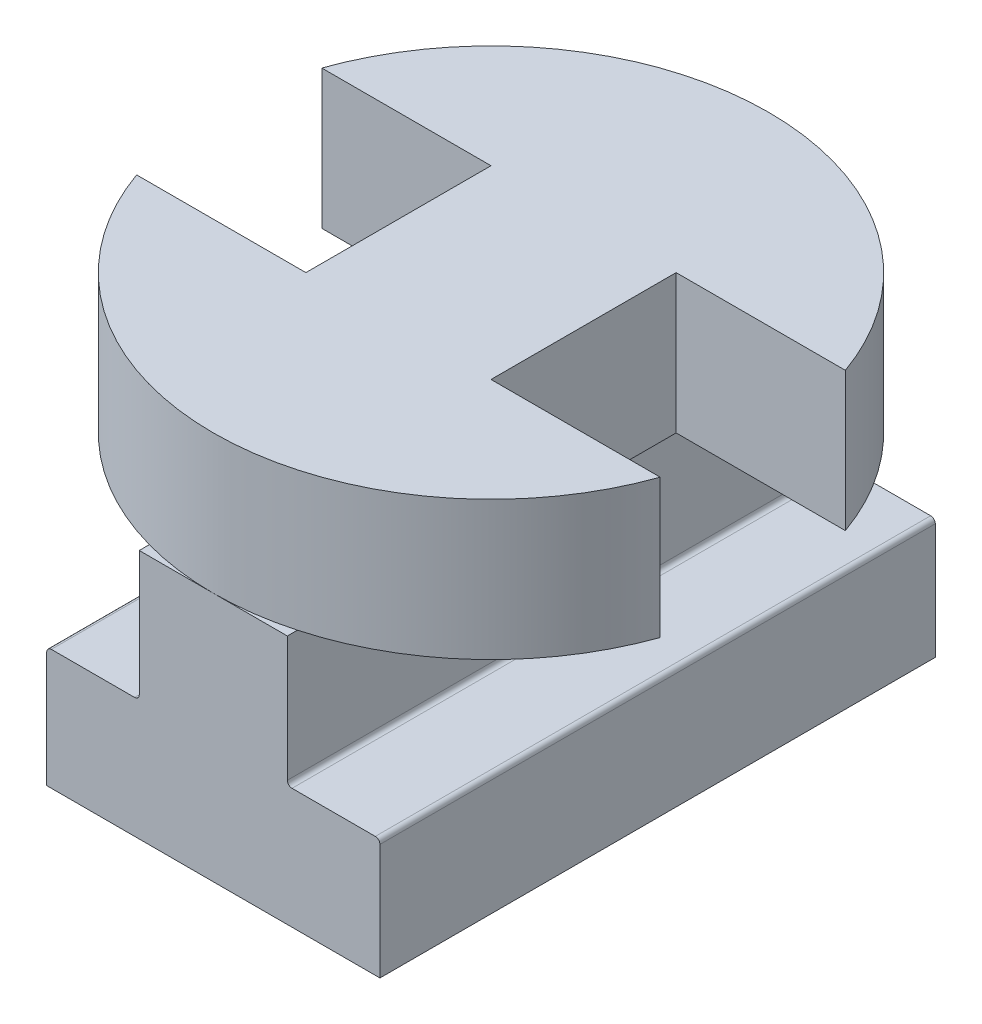
ISO-10303-21;
HEADER;
FILE_DESCRIPTION(('STEP AP214'),'2;1');
FILE_NAME('part.step','',(''),(''),'','','');
FILE_SCHEMA(('AUTOMOTIVE_DESIGN { 1 0 10303 214 1 1 1 1 }'));
ENDSEC;
DATA;
#1=APPLICATION_CONTEXT('core data for automotive mechanical design processes');
#2=APPLICATION_PROTOCOL_DEFINITION('international standard','automotive_design',2000,#1);
#3=PRODUCT_CONTEXT('',#1,'mechanical');
#4=PRODUCT('Part','Part','',(#3));
#5=PRODUCT_RELATED_PRODUCT_CATEGORY('part','',(#4));
#6=PRODUCT_DEFINITION_FORMATION('','',#4);
#7=PRODUCT_DEFINITION_CONTEXT('part definition',#1,'design');
#8=PRODUCT_DEFINITION('design','',#6,#7);
#9=PRODUCT_DEFINITION_SHAPE('','',#8);
#10=(LENGTH_UNIT() NAMED_UNIT(*) SI_UNIT(.MILLI.,.METRE.));
#11=(NAMED_UNIT(*) PLANE_ANGLE_UNIT() SI_UNIT($,.RADIAN.));
#12=(NAMED_UNIT(*) SI_UNIT($,.STERADIAN.) SOLID_ANGLE_UNIT());
#13=UNCERTAINTY_MEASURE_WITH_UNIT(LENGTH_MEASURE(1.E-05),#10,'distance_accuracy_value','');
#14=(GEOMETRIC_REPRESENTATION_CONTEXT(3) GLOBAL_UNCERTAINTY_ASSIGNED_CONTEXT((#13)) GLOBAL_UNIT_ASSIGNED_CONTEXT((#10,
#11,#12)) REPRESENTATION_CONTEXT('',''));
#15=CARTESIAN_POINT('',(0.,0.,0.));
#16=DIRECTION('',(0.,0.,1.));
#17=DIRECTION('',(1.,0.,0.));
#18=AXIS2_PLACEMENT_3D('',#15,#16,#17);
#19=CARTESIAN_POINT('',(0.,2.7,6.));
#20=DIRECTION('',(0.,1.,0.));
#21=DIRECTION('',(0.,0.,1.));
#22=AXIS2_PLACEMENT_3D('',#19,#20,#21);
#23=PLANE('',#22);
#24=CARTESIAN_POINT('',(0.,2.7,3.));
#25=DIRECTION('',(0.,1.,0.));
#26=DIRECTION('',(0.,0.,1.));
#27=AXIS2_PLACEMENT_3D('',#24,#25,#26);
#28=CIRCLE('',#27,3.);
#29=CARTESIAN_POINT('',(-0.800000000000001,2.7,5.89136645896019));
#30=VERTEX_POINT('',#29);
#31=CARTESIAN_POINT('',(0.,2.7,6.));
#32=VERTEX_POINT('',#31);
#33=EDGE_CURVE('E328',#30,#32,#28,.T.);
#34=ORIENTED_EDGE('',*,*,#33,.F.);
#35=DIRECTION('',(0.,0.,-1.));
#36=VECTOR('',#35,1.);
#37=CARTESIAN_POINT('',(-0.800000000000001,2.7,6.));
#38=LINE('',#37,#36);
#39=CARTESIAN_POINT('',(-0.800000000000001,2.7,6.));
#40=VERTEX_POINT('',#39);
#41=EDGE_CURVE('E319',#40,#30,#38,.T.);
#42=ORIENTED_EDGE('',*,*,#41,.F.);
#43=DIRECTION('',(1.,0.,0.));
#44=VECTOR('',#43,1.);
#45=CARTESIAN_POINT('',(0.,2.7,6.));
#46=LINE('',#45,#44);
#47=EDGE_CURVE('E264',#40,#32,#46,.T.);
#48=ORIENTED_EDGE('',*,*,#47,.T.);
#49=EDGE_LOOP('',(#34,#42,#48));
#50=FACE_BOUND('',#49,.T.);
#51=ADVANCED_FACE('F34',(#50),#23,.T.);
#52=CARTESIAN_POINT('',(0.8,2.7,5.89136645896019));
#53=VERTEX_POINT('',#52);
#54=EDGE_CURVE('E410',#32,#53,#28,.T.);
#55=ORIENTED_EDGE('',*,*,#54,.F.);
#56=CARTESIAN_POINT('',(0.8,2.7,6.));
#57=VERTEX_POINT('',#56);
#58=EDGE_CURVE('E268',#32,#57,#46,.T.);
#59=ORIENTED_EDGE('',*,*,#58,.T.);
#60=DIRECTION('',(0.,0.,-1.));
#61=VECTOR('',#60,1.);
#62=CARTESIAN_POINT('',(0.8,2.7,6.));
#63=LINE('',#62,#61);
#64=EDGE_CURVE('E308',#57,#53,#63,.T.);
#65=ORIENTED_EDGE('',*,*,#64,.T.);
#66=EDGE_LOOP('',(#55,#59,#65));
#67=FACE_BOUND('',#66,.T.);
#68=ADVANCED_FACE('F460',(#67),#23,.T.);
#69=CARTESIAN_POINT('',(0.8,2.7,0.108633541039807));
#70=VERTEX_POINT('',#69);
#71=CARTESIAN_POINT('',(0.,2.7,0.));
#72=VERTEX_POINT('',#71);
#73=EDGE_CURVE('E412',#70,#72,#28,.T.);
#74=ORIENTED_EDGE('',*,*,#73,.F.);
#75=CARTESIAN_POINT('',(0.8,2.7,0.));
#76=VERTEX_POINT('',#75);
#77=EDGE_CURVE('E285',#70,#76,#63,.T.);
#78=ORIENTED_EDGE('',*,*,#77,.T.);
#79=DIRECTION('',(1.,0.,0.));
#80=VECTOR('',#79,1.);
#81=CARTESIAN_POINT('',(0.,2.7,0.));
#82=LINE('',#81,#80);
#83=EDGE_CURVE('E215',#72,#76,#82,.T.);
#84=ORIENTED_EDGE('',*,*,#83,.F.);
#85=EDGE_LOOP('',(#74,#78,#84));
#86=FACE_BOUND('',#85,.T.);
#87=ADVANCED_FACE('F423',(#86),#23,.T.);
#88=CARTESIAN_POINT('',(-0.800000000000001,2.7,0.108633541039807));
#89=VERTEX_POINT('',#88);
#90=EDGE_CURVE('E322',#72,#89,#28,.T.);
#91=ORIENTED_EDGE('',*,*,#90,.F.);
#92=CARTESIAN_POINT('',(-0.800000000000001,2.7,0.));
#93=VERTEX_POINT('',#92);
#94=EDGE_CURVE('E286',#93,#72,#82,.T.);
#95=ORIENTED_EDGE('',*,*,#94,.F.);
#96=EDGE_CURVE('E318',#89,#93,#38,.T.);
#97=ORIENTED_EDGE('',*,*,#96,.F.);
#98=EDGE_LOOP('',(#91,#95,#97));
#99=FACE_BOUND('',#98,.T.);
#100=ADVANCED_FACE('F452',(#99),#23,.T.);
#101=CARTESIAN_POINT('',(-0.8,0.,6.));
#102=DIRECTION('',(1.,0.,0.));
#103=DIRECTION('',(0.,1.,0.));
#104=AXIS2_PLACEMENT_3D('',#101,#102,#103);
#105=PLANE('',#104);
#106=DIRECTION('',(0.,-1.,0.));
#107=VECTOR('',#106,1.);
#108=CARTESIAN_POINT('',(-0.8,0.,0.));
#109=LINE('',#108,#107);
#110=CARTESIAN_POINT('',(-0.8,1.35,0.));
#111=VERTEX_POINT('',#110);
#112=EDGE_CURVE('E289',#93,#111,#109,.T.);
#113=ORIENTED_EDGE('',*,*,#112,.T.);
#114=DIRECTION('',(0.,0.,-1.));
#115=VECTOR('',#114,1.);
#116=CARTESIAN_POINT('',(-0.8,1.35,6.));
#117=LINE('',#116,#115);
#118=CARTESIAN_POINT('',(-0.8,1.35,6.));
#119=VERTEX_POINT('',#118);
#120=EDGE_CURVE('E350',#111,#119,#117,.F.);
#121=ORIENTED_EDGE('',*,*,#120,.T.);
#122=DIRECTION('',(0.,-1.,0.));
#123=VECTOR('',#122,1.);
#124=CARTESIAN_POINT('',(-0.8,0.,6.));
#125=LINE('',#124,#123);
#126=EDGE_CURVE('E267',#40,#119,#125,.T.);
#127=ORIENTED_EDGE('',*,*,#126,.F.);
#128=ORIENTED_EDGE('',*,*,#41,.T.);
#129=EDGE_CURVE('E323',#30,#89,#38,.T.);
#130=ORIENTED_EDGE('',*,*,#129,.T.);
#131=ORIENTED_EDGE('',*,*,#96,.T.);
#132=EDGE_LOOP('',(#113,#121,#127,#128,#130,#131));
#133=FACE_BOUND('',#132,.T.);
#134=ADVANCED_FACE('F364',(#133),#105,.F.);
#135=CARTESIAN_POINT('',(0.,1.3,6.));
#136=DIRECTION('',(0.,-1.,0.));
#137=DIRECTION('',(1.,0.,0.));
#138=AXIS2_PLACEMENT_3D('',#135,#136,#137);
#139=PLANE('',#138);
#140=DIRECTION('',(-1.,0.,0.));
#141=VECTOR('',#140,1.);
#142=CARTESIAN_POINT('',(0.,1.3,0.));
#143=LINE('',#142,#141);
#144=CARTESIAN_POINT('',(-0.850000000000001,1.3,0.));
#145=VERTEX_POINT('',#144);
#146=CARTESIAN_POINT('',(-1.75,1.3,0.));
#147=VERTEX_POINT('',#146);
#148=EDGE_CURVE('E292',#145,#147,#143,.T.);
#149=ORIENTED_EDGE('',*,*,#148,.T.);
#150=DIRECTION('',(0.,0.,-1.));
#151=VECTOR('',#150,1.);
#152=CARTESIAN_POINT('',(-1.75,1.3,6.));
#153=LINE('',#152,#151);
#154=CARTESIAN_POINT('',(-1.75,1.3,6.));
#155=VERTEX_POINT('',#154);
#156=EDGE_CURVE('E335',#147,#155,#153,.F.);
#157=ORIENTED_EDGE('',*,*,#156,.T.);
#158=DIRECTION('',(-1.,0.,0.));
#159=VECTOR('',#158,1.);
#160=CARTESIAN_POINT('',(0.,1.3,6.));
#161=LINE('',#160,#159);
#162=CARTESIAN_POINT('',(-0.850000000000001,1.3,6.));
#163=VERTEX_POINT('',#162);
#164=EDGE_CURVE('E271',#163,#155,#161,.T.);
#165=ORIENTED_EDGE('',*,*,#164,.F.);
#166=DIRECTION('',(0.,0.,-1.));
#167=VECTOR('',#166,1.);
#168=CARTESIAN_POINT('',(-0.850000000000001,1.3,0.));
#169=LINE('',#168,#167);
#170=EDGE_CURVE('E332',#163,#145,#169,.T.);
#171=ORIENTED_EDGE('',*,*,#170,.T.);
#172=EDGE_LOOP('',(#149,#157,#165,#171));
#173=FACE_BOUND('',#172,.T.);
#174=ADVANCED_FACE('F373',(#173),#139,.F.);
#175=CARTESIAN_POINT('',(-1.8,0.,6.));
#176=DIRECTION('',(1.,0.,0.));
#177=DIRECTION('',(0.,0.,-1.));
#178=AXIS2_PLACEMENT_3D('',#175,#176,#177);
#179=PLANE('',#178);
#180=DIRECTION('',(0.,-1.,0.));
#181=VECTOR('',#180,1.);
#182=CARTESIAN_POINT('',(-1.8,0.,6.));
#183=LINE('',#182,#181);
#184=CARTESIAN_POINT('',(-1.8,1.25,6.));
#185=VERTEX_POINT('',#184);
#186=CARTESIAN_POINT('',(-1.8,0.,6.));
#187=VERTEX_POINT('',#186);
#188=EDGE_CURVE('E274',#185,#187,#183,.T.);
#189=ORIENTED_EDGE('',*,*,#188,.F.);
#190=DIRECTION('',(0.,0.,-1.));
#191=VECTOR('',#190,1.);
#192=CARTESIAN_POINT('',(-1.8,1.25,6.));
#193=LINE('',#192,#191);
#194=CARTESIAN_POINT('',(-1.8,1.25,0.));
#195=VERTEX_POINT('',#194);
#196=EDGE_CURVE('E324',#185,#195,#193,.T.);
#197=ORIENTED_EDGE('',*,*,#196,.T.);
#198=DIRECTION('',(0.,-1.,0.));
#199=VECTOR('',#198,1.);
#200=CARTESIAN_POINT('',(-1.8,0.,0.));
#201=LINE('',#200,#199);
#202=CARTESIAN_POINT('',(-1.8,0.,0.));
#203=VERTEX_POINT('',#202);
#204=EDGE_CURVE('E295',#195,#203,#201,.T.);
#205=ORIENTED_EDGE('',*,*,#204,.T.);
#206=DIRECTION('',(0.,0.,-1.));
#207=VECTOR('',#206,1.);
#208=CARTESIAN_POINT('',(-1.8,0.,6.));
#209=LINE('',#208,#207);
#210=EDGE_CURVE('E315',#187,#203,#209,.T.);
#211=ORIENTED_EDGE('',*,*,#210,.F.);
#212=EDGE_LOOP('',(#189,#197,#205,#211));
#213=FACE_BOUND('',#212,.T.);
#214=ADVANCED_FACE('F381',(#213),#179,.F.);
#215=CARTESIAN_POINT('',(0.,0.,6.));
#216=DIRECTION('',(0.,1.,0.));
#217=DIRECTION('',(-1.,0.,0.));
#218=AXIS2_PLACEMENT_3D('',#215,#216,#217);
#219=PLANE('',#218);
#220=DIRECTION('',(1.,0.,0.));
#221=VECTOR('',#220,1.);
#222=CARTESIAN_POINT('',(0.,0.,0.));
#223=LINE('',#222,#221);
#224=CARTESIAN_POINT('',(1.8,0.,0.));
#225=VERTEX_POINT('',#224);
#226=EDGE_CURVE('E297',#203,#225,#223,.T.);
#227=ORIENTED_EDGE('',*,*,#226,.T.);
#228=DIRECTION('',(0.,0.,-1.));
#229=VECTOR('',#228,1.);
#230=CARTESIAN_POINT('',(1.8,0.,6.));
#231=LINE('',#230,#229);
#232=CARTESIAN_POINT('',(1.8,0.,6.));
#233=VERTEX_POINT('',#232);
#234=EDGE_CURVE('E311',#233,#225,#231,.T.);
#235=ORIENTED_EDGE('',*,*,#234,.F.);
#236=DIRECTION('',(1.,0.,0.));
#237=VECTOR('',#236,1.);
#238=CARTESIAN_POINT('',(0.,0.,6.));
#239=LINE('',#238,#237);
#240=EDGE_CURVE('E276',#187,#233,#239,.T.);
#241=ORIENTED_EDGE('',*,*,#240,.F.);
#242=ORIENTED_EDGE('',*,*,#210,.T.);
#243=EDGE_LOOP('',(#227,#235,#241,#242));
#244=FACE_BOUND('',#243,.T.);
#245=ADVANCED_FACE('F386',(#244),#219,.F.);
#246=CARTESIAN_POINT('',(1.8,0.,6.));
#247=DIRECTION('',(1.,0.,0.));
#248=DIRECTION('',(0.,1.,0.));
#249=AXIS2_PLACEMENT_3D('',#246,#247,#248);
#250=PLANE('',#249);
#251=DIRECTION('',(0.,-1.,0.));
#252=VECTOR('',#251,1.);
#253=CARTESIAN_POINT('',(1.8,0.,0.));
#254=LINE('',#253,#252);
#255=CARTESIAN_POINT('',(1.8,1.25,0.));
#256=VERTEX_POINT('',#255);
#257=EDGE_CURVE('E300',#256,#225,#254,.T.);
#258=ORIENTED_EDGE('',*,*,#257,.F.);
#259=DIRECTION('',(0.,0.,-1.));
#260=VECTOR('',#259,1.);
#261=CARTESIAN_POINT('',(1.8,1.25,6.));
#262=LINE('',#261,#260);
#263=CARTESIAN_POINT('',(1.8,1.25,6.));
#264=VERTEX_POINT('',#263);
#265=EDGE_CURVE('E345',#256,#264,#262,.F.);
#266=ORIENTED_EDGE('',*,*,#265,.T.);
#267=DIRECTION('',(0.,-1.,0.));
#268=VECTOR('',#267,1.);
#269=CARTESIAN_POINT('',(1.8,0.,6.));
#270=LINE('',#269,#268);
#271=EDGE_CURVE('E279',#264,#233,#270,.T.);
#272=ORIENTED_EDGE('',*,*,#271,.T.);
#273=ORIENTED_EDGE('',*,*,#234,.T.);
#274=EDGE_LOOP('',(#258,#266,#272,#273));
#275=FACE_BOUND('',#274,.T.);
#276=ADVANCED_FACE('F600',(#275),#250,.T.);
#277=CARTESIAN_POINT('',(0.,1.3,6.));
#278=DIRECTION('',(0.,1.,0.));
#279=DIRECTION('',(-1.,0.,0.));
#280=AXIS2_PLACEMENT_3D('',#277,#278,#279);
#281=PLANE('',#280);
#282=DIRECTION('',(1.,0.,0.));
#283=VECTOR('',#282,1.);
#284=CARTESIAN_POINT('',(0.,1.3,6.));
#285=LINE('',#284,#283);
#286=CARTESIAN_POINT('',(0.85,1.3,6.));
#287=VERTEX_POINT('',#286);
#288=CARTESIAN_POINT('',(1.75,1.3,6.));
#289=VERTEX_POINT('',#288);
#290=EDGE_CURVE('E281',#287,#289,#285,.T.);
#291=ORIENTED_EDGE('',*,*,#290,.T.);
#292=DIRECTION('',(0.,0.,-1.));
#293=VECTOR('',#292,1.);
#294=CARTESIAN_POINT('',(1.75,1.3,6.));
#295=LINE('',#294,#293);
#296=CARTESIAN_POINT('',(1.75,1.3,0.));
#297=VERTEX_POINT('',#296);
#298=EDGE_CURVE('E342',#289,#297,#295,.T.);
#299=ORIENTED_EDGE('',*,*,#298,.T.);
#300=DIRECTION('',(1.,0.,0.));
#301=VECTOR('',#300,1.);
#302=CARTESIAN_POINT('',(0.,1.3,0.));
#303=LINE('',#302,#301);
#304=CARTESIAN_POINT('',(0.85,1.3,0.));
#305=VERTEX_POINT('',#304);
#306=EDGE_CURVE('E302',#305,#297,#303,.T.);
#307=ORIENTED_EDGE('',*,*,#306,.F.);
#308=DIRECTION('',(0.,0.,-1.));
#309=VECTOR('',#308,1.);
#310=CARTESIAN_POINT('',(0.85,1.3,6.));
#311=LINE('',#310,#309);
#312=EDGE_CURVE('E340',#305,#287,#311,.F.);
#313=ORIENTED_EDGE('',*,*,#312,.T.);
#314=EDGE_LOOP('',(#291,#299,#307,#313));
#315=FACE_BOUND('',#314,.T.);
#316=ADVANCED_FACE('F394',(#315),#281,.T.);
#317=CARTESIAN_POINT('',(0.8,0.,6.));
#318=DIRECTION('',(1.,0.,0.));
#319=DIRECTION('',(0.,1.,0.));
#320=AXIS2_PLACEMENT_3D('',#317,#318,#319);
#321=PLANE('',#320);
#322=DIRECTION('',(0.,-1.,0.));
#323=VECTOR('',#322,1.);
#324=CARTESIAN_POINT('',(0.8,0.,6.));
#325=LINE('',#324,#323);
#326=CARTESIAN_POINT('',(0.8,1.35,6.));
#327=VERTEX_POINT('',#326);
#328=EDGE_CURVE('E283',#57,#327,#325,.T.);
#329=ORIENTED_EDGE('',*,*,#328,.T.);
#330=DIRECTION('',(0.,0.,-1.));
#331=VECTOR('',#330,1.);
#332=CARTESIAN_POINT('',(0.8,1.35,0.));
#333=LINE('',#332,#331);
#334=CARTESIAN_POINT('',(0.8,1.35,0.));
#335=VERTEX_POINT('',#334);
#336=EDGE_CURVE('E347',#327,#335,#333,.T.);
#337=ORIENTED_EDGE('',*,*,#336,.T.);
#338=DIRECTION('',(0.,-1.,0.));
#339=VECTOR('',#338,1.);
#340=CARTESIAN_POINT('',(0.8,0.,0.));
#341=LINE('',#340,#339);
#342=EDGE_CURVE('E305',#76,#335,#341,.T.);
#343=ORIENTED_EDGE('',*,*,#342,.F.);
#344=ORIENTED_EDGE('',*,*,#77,.F.);
#345=EDGE_CURVE('E312',#53,#70,#63,.T.);
#346=ORIENTED_EDGE('',*,*,#345,.F.);
#347=ORIENTED_EDGE('',*,*,#64,.F.);
#348=EDGE_LOOP('',(#329,#337,#343,#344,#346,#347));
#349=FACE_BOUND('',#348,.T.);
#350=ADVANCED_FACE('F403',(#349),#321,.T.);
#351=CARTESIAN_POINT('',(0.,0.,6.));
#352=DIRECTION('',(0.,0.,1.));
#353=DIRECTION('',(1.,0.,0.));
#354=AXIS2_PLACEMENT_3D('',#351,#352,#353);
#355=PLANE('',#354);
#356=ORIENTED_EDGE('',*,*,#164,.T.);
#357=CARTESIAN_POINT('',(-1.75,1.25,6.));
#358=DIRECTION('',(0.,0.,1.));
#359=DIRECTION('',(1.,0.,0.));
#360=AXIS2_PLACEMENT_3D('',#357,#358,#359);
#361=CIRCLE('',#360,0.05);
#362=EDGE_CURVE('E338',#155,#185,#361,.T.);
#363=ORIENTED_EDGE('',*,*,#362,.T.);
#364=ORIENTED_EDGE('',*,*,#188,.T.);
#365=ORIENTED_EDGE('',*,*,#240,.T.);
#366=ORIENTED_EDGE('',*,*,#271,.F.);
#367=CARTESIAN_POINT('',(1.75,1.25,6.));
#368=DIRECTION('',(0.,0.,1.));
#369=DIRECTION('',(1.,0.,0.));
#370=AXIS2_PLACEMENT_3D('',#367,#368,#369);
#371=CIRCLE('',#370,0.05);
#372=EDGE_CURVE('E55',#264,#289,#371,.T.);
#373=ORIENTED_EDGE('',*,*,#372,.T.);
#374=ORIENTED_EDGE('',*,*,#290,.F.);
#375=CARTESIAN_POINT('',(0.85,1.35,6.));
#376=DIRECTION('',(0.,0.,1.));
#377=DIRECTION('',(1.,0.,0.));
#378=AXIS2_PLACEMENT_3D('',#375,#376,#377);
#379=CIRCLE('',#378,0.05);
#380=EDGE_CURVE('E49',#287,#327,#379,.F.);
#381=ORIENTED_EDGE('',*,*,#380,.T.);
#382=ORIENTED_EDGE('',*,*,#328,.F.);
#383=ORIENTED_EDGE('',*,*,#58,.F.);
#384=ORIENTED_EDGE('',*,*,#47,.F.);
#385=ORIENTED_EDGE('',*,*,#126,.T.);
#386=CARTESIAN_POINT('',(-0.850000000000001,1.35,6.));
#387=DIRECTION('',(0.,0.,1.));
#388=DIRECTION('',(1.,0.,0.));
#389=AXIS2_PLACEMENT_3D('',#386,#387,#388);
#390=CIRCLE('',#389,0.05);
#391=EDGE_CURVE('E11',#119,#163,#390,.F.);
#392=ORIENTED_EDGE('',*,*,#391,.T.);
#393=EDGE_LOOP('',(#356,#363,#364,#365,#366,#373,#374,#381,#382,#383,#384,#385,#392));
#394=FACE_BOUND('',#393,.T.);
#395=ADVANCED_FACE('F369',(#394),#355,.T.);
#396=CARTESIAN_POINT('',(0.,0.,0.));
#397=DIRECTION('',(0.,0.,1.));
#398=DIRECTION('',(1.,0.,0.));
#399=AXIS2_PLACEMENT_3D('',#396,#397,#398);
#400=PLANE('',#399);
#401=ORIENTED_EDGE('',*,*,#204,.F.);
#402=CARTESIAN_POINT('',(-1.75,1.25,0.));
#403=DIRECTION('',(0.,0.,1.));
#404=DIRECTION('',(1.,0.,0.));
#405=AXIS2_PLACEMENT_3D('',#402,#403,#404);
#406=CIRCLE('',#405,0.05);
#407=EDGE_CURVE('E330',#195,#147,#406,.F.);
#408=ORIENTED_EDGE('',*,*,#407,.T.);
#409=ORIENTED_EDGE('',*,*,#148,.F.);
#410=CARTESIAN_POINT('',(-0.850000000000001,1.35,0.));
#411=DIRECTION('',(0.,0.,1.));
#412=DIRECTION('',(1.,0.,0.));
#413=AXIS2_PLACEMENT_3D('',#410,#411,#412);
#414=CIRCLE('',#413,0.05);
#415=EDGE_CURVE('E42',#145,#111,#414,.T.);
#416=ORIENTED_EDGE('',*,*,#415,.T.);
#417=ORIENTED_EDGE('',*,*,#112,.F.);
#418=ORIENTED_EDGE('',*,*,#94,.T.);
#419=ORIENTED_EDGE('',*,*,#83,.T.);
#420=ORIENTED_EDGE('',*,*,#342,.T.);
#421=CARTESIAN_POINT('',(0.85,1.35,0.));
#422=DIRECTION('',(0.,0.,1.));
#423=DIRECTION('',(1.,0.,0.));
#424=AXIS2_PLACEMENT_3D('',#421,#422,#423);
#425=CIRCLE('',#424,0.05);
#426=EDGE_CURVE('E352',#335,#305,#425,.T.);
#427=ORIENTED_EDGE('',*,*,#426,.T.);
#428=ORIENTED_EDGE('',*,*,#306,.T.);
#429=CARTESIAN_POINT('',(1.75,1.25,0.));
#430=DIRECTION('',(0.,0.,1.));
#431=DIRECTION('',(1.,0.,0.));
#432=AXIS2_PLACEMENT_3D('',#429,#430,#431);
#433=CIRCLE('',#432,0.05);
#434=EDGE_CURVE('E327',#297,#256,#433,.F.);
#435=ORIENTED_EDGE('',*,*,#434,.T.);
#436=ORIENTED_EDGE('',*,*,#257,.T.);
#437=ORIENTED_EDGE('',*,*,#226,.F.);
#438=EDGE_LOOP('',(#401,#408,#409,#416,#417,#418,#419,#420,#427,#428,#435,#436,#437));
#439=FACE_BOUND('',#438,.T.);
#440=ADVANCED_FACE('F358',(#439),#400,.F.);
#441=CARTESIAN_POINT('',(0.,2.7,0.));
#442=DIRECTION('',(0.,1.,0.));
#443=DIRECTION('',(0.,0.,1.));
#444=AXIS2_PLACEMENT_3D('',#441,#442,#443);
#445=PLANE('',#444);
#446=CARTESIAN_POINT('',(2.82842712474619,2.7,4.));
#447=VERTEX_POINT('',#446);
#448=EDGE_CURVE('E211',#53,#447,#28,.T.);
#449=ORIENTED_EDGE('',*,*,#448,.F.);
#450=ORIENTED_EDGE('',*,*,#345,.T.);
#451=CARTESIAN_POINT('',(2.82842712474619,2.7,2.));
#452=VERTEX_POINT('',#451);
#453=EDGE_CURVE('E236',#452,#70,#28,.T.);
#454=ORIENTED_EDGE('',*,*,#453,.F.);
#455=DIRECTION('',(1.,0.,0.));
#456=VECTOR('',#455,1.);
#457=CARTESIAN_POINT('',(0.,2.7,2.));
#458=LINE('',#457,#456);
#459=CARTESIAN_POINT('',(1.,2.7,2.));
#460=VERTEX_POINT('',#459);
#461=EDGE_CURVE('E241',#460,#452,#458,.T.);
#462=ORIENTED_EDGE('',*,*,#461,.F.);
#463=DIRECTION('',(0.,0.,1.));
#464=VECTOR('',#463,1.);
#465=CARTESIAN_POINT('',(1.,2.7,0.));
#466=LINE('',#465,#464);
#467=CARTESIAN_POINT('',(1.,2.7,4.));
#468=VERTEX_POINT('',#467);
#469=EDGE_CURVE('E238',#460,#468,#466,.T.);
#470=ORIENTED_EDGE('',*,*,#469,.T.);
#471=DIRECTION('',(1.,0.,0.));
#472=VECTOR('',#471,1.);
#473=CARTESIAN_POINT('',(0.,2.7,4.));
#474=LINE('',#473,#472);
#475=EDGE_CURVE('E234',#468,#447,#474,.T.);
#476=ORIENTED_EDGE('',*,*,#475,.T.);
#477=EDGE_LOOP('',(#449,#450,#454,#462,#470,#476));
#478=FACE_BOUND('',#477,.T.);
#479=ADVANCED_FACE('F426',(#478),#445,.F.);
#480=CARTESIAN_POINT('',(0.,4.2,3.));
#481=DIRECTION('',(0.,-1.,0.));
#482=DIRECTION('',(0.,0.,-1.));
#483=AXIS2_PLACEMENT_3D('',#480,#481,#482);
#484=CYLINDRICAL_SURFACE('',#483,3.);
#485=CARTESIAN_POINT('',(-2.82842712474619,2.7,4.));
#486=VERTEX_POINT('',#485);
#487=EDGE_CURVE('E232',#486,#30,#28,.T.);
#488=ORIENTED_EDGE('',*,*,#487,.T.);
#489=ORIENTED_EDGE('',*,*,#33,.T.);
#490=ORIENTED_EDGE('',*,*,#54,.T.);
#491=ORIENTED_EDGE('',*,*,#448,.T.);
#492=DIRECTION('',(0.,-1.,0.));
#493=VECTOR('',#492,1.);
#494=CARTESIAN_POINT('',(2.82842712474619,4.2,4.));
#495=LINE('',#494,#493);
#496=CARTESIAN_POINT('',(2.82842712474619,4.2,4.));
#497=VERTEX_POINT('',#496);
#498=EDGE_CURVE('E206',#497,#447,#495,.T.);
#499=ORIENTED_EDGE('',*,*,#498,.F.);
#500=CARTESIAN_POINT('',(0.,4.2,3.));
#501=DIRECTION('',(0.,1.,0.));
#502=DIRECTION('',(0.,0.,1.));
#503=AXIS2_PLACEMENT_3D('',#500,#501,#502);
#504=CIRCLE('',#503,3.);
#505=CARTESIAN_POINT('',(-2.82842712474619,4.2,4.));
#506=VERTEX_POINT('',#505);
#507=EDGE_CURVE('E190',#506,#497,#504,.T.);
#508=ORIENTED_EDGE('',*,*,#507,.F.);
#509=DIRECTION('',(0.,-1.,0.));
#510=VECTOR('',#509,1.);
#511=CARTESIAN_POINT('',(-2.82842712474619,4.2,4.));
#512=LINE('',#511,#510);
#513=EDGE_CURVE('E231',#506,#486,#512,.T.);
#514=ORIENTED_EDGE('',*,*,#513,.T.);
#515=EDGE_LOOP('',(#488,#489,#490,#491,#499,#508,#514));
#516=FACE_BOUND('',#515,.T.);
#517=ADVANCED_FACE('F208',(#516),#484,.T.);
#518=CARTESIAN_POINT('',(0.,4.2,4.));
#519=DIRECTION('',(0.,0.,-1.));
#520=DIRECTION('',(-1.,0.,0.));
#521=AXIS2_PLACEMENT_3D('',#518,#519,#520);
#522=PLANE('',#521);
#523=ORIENTED_EDGE('',*,*,#475,.F.);
#524=DIRECTION('',(0.,-1.,0.));
#525=VECTOR('',#524,1.);
#526=CARTESIAN_POINT('',(1.,4.2,4.));
#527=LINE('',#526,#525);
#528=CARTESIAN_POINT('',(1.,4.2,4.));
#529=VERTEX_POINT('',#528);
#530=EDGE_CURVE('E216',#529,#468,#527,.T.);
#531=ORIENTED_EDGE('',*,*,#530,.F.);
#532=DIRECTION('',(1.,0.,0.));
#533=VECTOR('',#532,1.);
#534=CARTESIAN_POINT('',(0.,4.2,4.));
#535=LINE('',#534,#533);
#536=EDGE_CURVE('E195',#529,#497,#535,.T.);
#537=ORIENTED_EDGE('',*,*,#536,.T.);
#538=ORIENTED_EDGE('',*,*,#498,.T.);
#539=EDGE_LOOP('',(#523,#531,#537,#538));
#540=FACE_BOUND('',#539,.T.);
#541=ADVANCED_FACE('F218',(#540),#522,.T.);
#542=CARTESIAN_POINT('',(1.,4.2,0.));
#543=DIRECTION('',(1.,0.,0.));
#544=DIRECTION('',(0.,0.,-1.));
#545=AXIS2_PLACEMENT_3D('',#542,#543,#544);
#546=PLANE('',#545);
#547=ORIENTED_EDGE('',*,*,#469,.F.);
#548=DIRECTION('',(0.,-1.,0.));
#549=VECTOR('',#548,1.);
#550=CARTESIAN_POINT('',(1.,4.2,2.));
#551=LINE('',#550,#549);
#552=CARTESIAN_POINT('',(1.,4.2,2.));
#553=VERTEX_POINT('',#552);
#554=EDGE_CURVE('E261',#553,#460,#551,.T.);
#555=ORIENTED_EDGE('',*,*,#554,.F.);
#556=DIRECTION('',(0.,0.,1.));
#557=VECTOR('',#556,1.);
#558=CARTESIAN_POINT('',(1.,4.2,0.));
#559=LINE('',#558,#557);
#560=EDGE_CURVE('E219',#553,#529,#559,.T.);
#561=ORIENTED_EDGE('',*,*,#560,.T.);
#562=ORIENTED_EDGE('',*,*,#530,.T.);
#563=EDGE_LOOP('',(#547,#555,#561,#562));
#564=FACE_BOUND('',#563,.T.);
#565=ADVANCED_FACE('F430',(#564),#546,.T.);
#566=CARTESIAN_POINT('',(0.,4.2,2.));
#567=DIRECTION('',(0.,0.,-1.));
#568=DIRECTION('',(-1.,0.,0.));
#569=AXIS2_PLACEMENT_3D('',#566,#567,#568);
#570=PLANE('',#569);
#571=ORIENTED_EDGE('',*,*,#461,.T.);
#572=DIRECTION('',(0.,-1.,0.));
#573=VECTOR('',#572,1.);
#574=CARTESIAN_POINT('',(2.82842712474619,4.2,2.));
#575=LINE('',#574,#573);
#576=CARTESIAN_POINT('',(2.82842712474619,4.2,2.));
#577=VERTEX_POINT('',#576);
#578=EDGE_CURVE('E258',#577,#452,#575,.T.);
#579=ORIENTED_EDGE('',*,*,#578,.F.);
#580=DIRECTION('',(1.,0.,0.));
#581=VECTOR('',#580,1.);
#582=CARTESIAN_POINT('',(0.,4.2,2.));
#583=LINE('',#582,#581);
#584=EDGE_CURVE('E221',#553,#577,#583,.T.);
#585=ORIENTED_EDGE('',*,*,#584,.F.);
#586=ORIENTED_EDGE('',*,*,#554,.T.);
#587=EDGE_LOOP('',(#571,#579,#585,#586));
#588=FACE_BOUND('',#587,.T.);
#589=ADVANCED_FACE('F436',(#588),#570,.F.);
#590=ORIENTED_EDGE('',*,*,#453,.T.);
#591=ORIENTED_EDGE('',*,*,#73,.T.);
#592=ORIENTED_EDGE('',*,*,#90,.T.);
#593=CARTESIAN_POINT('',(-2.82842712474619,2.7,2.));
#594=VERTEX_POINT('',#593);
#595=EDGE_CURVE('E235',#89,#594,#28,.T.);
#596=ORIENTED_EDGE('',*,*,#595,.T.);
#597=DIRECTION('',(0.,-1.,0.));
#598=VECTOR('',#597,1.);
#599=CARTESIAN_POINT('',(-2.82842712474619,4.2,2.));
#600=LINE('',#599,#598);
#601=CARTESIAN_POINT('',(-2.82842712474619,4.2,2.));
#602=VERTEX_POINT('',#601);
#603=EDGE_CURVE('E255',#602,#594,#600,.T.);
#604=ORIENTED_EDGE('',*,*,#603,.F.);
#605=EDGE_CURVE('E204',#577,#602,#504,.T.);
#606=ORIENTED_EDGE('',*,*,#605,.F.);
#607=ORIENTED_EDGE('',*,*,#578,.T.);
#608=EDGE_LOOP('',(#590,#591,#592,#596,#604,#606,#607));
#609=FACE_BOUND('',#608,.T.);
#610=ADVANCED_FACE('F420',(#609),#484,.T.);
#611=CARTESIAN_POINT('',(0.,4.2,2.));
#612=DIRECTION('',(0.,0.,1.));
#613=DIRECTION('',(1.,0.,0.));
#614=AXIS2_PLACEMENT_3D('',#611,#612,#613);
#615=PLANE('',#614);
#616=DIRECTION('',(-1.,0.,0.));
#617=VECTOR('',#616,1.);
#618=CARTESIAN_POINT('',(0.,2.7,2.));
#619=LINE('',#618,#617);
#620=CARTESIAN_POINT('',(-1.,2.7,2.));
#621=VERTEX_POINT('',#620);
#622=EDGE_CURVE('E243',#621,#594,#619,.T.);
#623=ORIENTED_EDGE('',*,*,#622,.F.);
#624=DIRECTION('',(0.,-1.,0.));
#625=VECTOR('',#624,1.);
#626=CARTESIAN_POINT('',(-1.,4.2,2.));
#627=LINE('',#626,#625);
#628=CARTESIAN_POINT('',(-1.,4.2,2.));
#629=VERTEX_POINT('',#628);
#630=EDGE_CURVE('E253',#629,#621,#627,.T.);
#631=ORIENTED_EDGE('',*,*,#630,.F.);
#632=DIRECTION('',(-1.,0.,0.));
#633=VECTOR('',#632,1.);
#634=CARTESIAN_POINT('',(0.,4.2,2.));
#635=LINE('',#634,#633);
#636=EDGE_CURVE('E225',#629,#602,#635,.T.);
#637=ORIENTED_EDGE('',*,*,#636,.T.);
#638=ORIENTED_EDGE('',*,*,#603,.T.);
#639=EDGE_LOOP('',(#623,#631,#637,#638));
#640=FACE_BOUND('',#639,.T.);
#641=ADVANCED_FACE('F439',(#640),#615,.T.);
#642=CARTESIAN_POINT('',(-1.,4.2,0.));
#643=DIRECTION('',(1.,0.,0.));
#644=DIRECTION('',(0.,0.,-1.));
#645=AXIS2_PLACEMENT_3D('',#642,#643,#644);
#646=PLANE('',#645);
#647=DIRECTION('',(0.,0.,1.));
#648=VECTOR('',#647,1.);
#649=CARTESIAN_POINT('',(-1.,2.7,0.));
#650=LINE('',#649,#648);
#651=CARTESIAN_POINT('',(-1.,2.7,4.));
#652=VERTEX_POINT('',#651);
#653=EDGE_CURVE('E246',#621,#652,#650,.T.);
#654=ORIENTED_EDGE('',*,*,#653,.T.);
#655=DIRECTION('',(0.,-1.,0.));
#656=VECTOR('',#655,1.);
#657=CARTESIAN_POINT('',(-1.,4.2,4.));
#658=LINE('',#657,#656);
#659=CARTESIAN_POINT('',(-1.,4.2,4.));
#660=VERTEX_POINT('',#659);
#661=EDGE_CURVE('E250',#660,#652,#658,.T.);
#662=ORIENTED_EDGE('',*,*,#661,.F.);
#663=DIRECTION('',(0.,0.,1.));
#664=VECTOR('',#663,1.);
#665=CARTESIAN_POINT('',(-1.,4.2,0.));
#666=LINE('',#665,#664);
#667=EDGE_CURVE('E228',#629,#660,#666,.T.);
#668=ORIENTED_EDGE('',*,*,#667,.F.);
#669=ORIENTED_EDGE('',*,*,#630,.T.);
#670=EDGE_LOOP('',(#654,#662,#668,#669));
#671=FACE_BOUND('',#670,.T.);
#672=ADVANCED_FACE('F443',(#671),#646,.F.);
#673=CARTESIAN_POINT('',(0.,4.2,4.));
#674=DIRECTION('',(0.,0.,1.));
#675=DIRECTION('',(1.,0.,0.));
#676=AXIS2_PLACEMENT_3D('',#673,#674,#675);
#677=PLANE('',#676);
#678=DIRECTION('',(-1.,0.,0.));
#679=VECTOR('',#678,1.);
#680=CARTESIAN_POINT('',(0.,2.7,4.));
#681=LINE('',#680,#679);
#682=EDGE_CURVE('E202',#652,#486,#681,.T.);
#683=ORIENTED_EDGE('',*,*,#682,.T.);
#684=ORIENTED_EDGE('',*,*,#513,.F.);
#685=DIRECTION('',(-1.,0.,0.));
#686=VECTOR('',#685,1.);
#687=CARTESIAN_POINT('',(0.,4.2,4.));
#688=LINE('',#687,#686);
#689=EDGE_CURVE('E198',#660,#506,#688,.T.);
#690=ORIENTED_EDGE('',*,*,#689,.F.);
#691=ORIENTED_EDGE('',*,*,#661,.T.);
#692=EDGE_LOOP('',(#683,#684,#690,#691));
#693=FACE_BOUND('',#692,.T.);
#694=ADVANCED_FACE('F447',(#693),#677,.F.);
#695=CARTESIAN_POINT('',(0.,4.2,0.));
#696=DIRECTION('',(0.,1.,0.));
#697=DIRECTION('',(0.,0.,1.));
#698=AXIS2_PLACEMENT_3D('',#695,#696,#697);
#699=PLANE('',#698);
#700=ORIENTED_EDGE('',*,*,#507,.T.);
#701=ORIENTED_EDGE('',*,*,#536,.F.);
#702=ORIENTED_EDGE('',*,*,#560,.F.);
#703=ORIENTED_EDGE('',*,*,#584,.T.);
#704=ORIENTED_EDGE('',*,*,#605,.T.);
#705=ORIENTED_EDGE('',*,*,#636,.F.);
#706=ORIENTED_EDGE('',*,*,#667,.T.);
#707=ORIENTED_EDGE('',*,*,#689,.T.);
#708=EDGE_LOOP('',(#700,#701,#702,#703,#704,#705,#706,#707));
#709=FACE_BOUND('',#708,.T.);
#710=ADVANCED_FACE('F192',(#709),#699,.T.);
#711=ORIENTED_EDGE('',*,*,#129,.F.);
#712=ORIENTED_EDGE('',*,*,#487,.F.);
#713=ORIENTED_EDGE('',*,*,#682,.F.);
#714=ORIENTED_EDGE('',*,*,#653,.F.);
#715=ORIENTED_EDGE('',*,*,#622,.T.);
#716=ORIENTED_EDGE('',*,*,#595,.F.);
#717=EDGE_LOOP('',(#711,#712,#713,#714,#715,#716));
#718=FACE_BOUND('',#717,.T.);
#719=ADVANCED_FACE('F450',(#718),#445,.F.);
#720=CARTESIAN_POINT('',(-1.75,1.25,6.));
#721=DIRECTION('',(0.,0.,-1.));
#722=DIRECTION('',(-1.,0.,0.));
#723=AXIS2_PLACEMENT_3D('',#720,#721,#722);
#724=CYLINDRICAL_SURFACE('',#723,0.05);
#725=ORIENTED_EDGE('',*,*,#362,.F.);
#726=ORIENTED_EDGE('',*,*,#156,.F.);
#727=ORIENTED_EDGE('',*,*,#407,.F.);
#728=ORIENTED_EDGE('',*,*,#196,.F.);
#729=EDGE_LOOP('',(#725,#726,#727,#728));
#730=FACE_BOUND('',#729,.T.);
#731=ADVANCED_FACE('F376',(#730),#724,.T.);
#732=CARTESIAN_POINT('',(1.75,1.25,6.));
#733=DIRECTION('',(0.,0.,-1.));
#734=DIRECTION('',(-1.,0.,0.));
#735=AXIS2_PLACEMENT_3D('',#732,#733,#734);
#736=CYLINDRICAL_SURFACE('',#735,0.05);
#737=ORIENTED_EDGE('',*,*,#372,.F.);
#738=ORIENTED_EDGE('',*,*,#265,.F.);
#739=ORIENTED_EDGE('',*,*,#434,.F.);
#740=ORIENTED_EDGE('',*,*,#298,.F.);
#741=EDGE_LOOP('',(#737,#738,#739,#740));
#742=FACE_BOUND('',#741,.T.);
#743=ADVANCED_FACE('F391',(#742),#736,.T.);
#744=CARTESIAN_POINT('',(0.85,1.35,6.));
#745=DIRECTION('',(0.,0.,1.));
#746=DIRECTION('',(1.,0.,0.));
#747=AXIS2_PLACEMENT_3D('',#744,#745,#746);
#748=CYLINDRICAL_SURFACE('',#747,0.05);
#749=ORIENTED_EDGE('',*,*,#380,.F.);
#750=ORIENTED_EDGE('',*,*,#312,.F.);
#751=ORIENTED_EDGE('',*,*,#426,.F.);
#752=ORIENTED_EDGE('',*,*,#336,.F.);
#753=EDGE_LOOP('',(#749,#750,#751,#752));
#754=FACE_BOUND('',#753,.T.);
#755=ADVANCED_FACE('F401',(#754),#748,.F.);
#756=CARTESIAN_POINT('',(-0.850000000000001,1.35,6.));
#757=DIRECTION('',(0.,0.,1.));
#758=DIRECTION('',(1.,0.,0.));
#759=AXIS2_PLACEMENT_3D('',#756,#757,#758);
#760=CYLINDRICAL_SURFACE('',#759,0.05);
#761=ORIENTED_EDGE('',*,*,#391,.F.);
#762=ORIENTED_EDGE('',*,*,#120,.F.);
#763=ORIENTED_EDGE('',*,*,#415,.F.);
#764=ORIENTED_EDGE('',*,*,#170,.F.);
#765=EDGE_LOOP('',(#761,#762,#763,#764));
#766=FACE_BOUND('',#765,.T.);
#767=ADVANCED_FACE('F36',(#766),#760,.F.);
#768=CLOSED_SHELL('',(#51,#68,#87,#100,#134,#174,#214,#245,#276,#316,#350,#395,#440,#479,#517,
#541,#565,#589,#610,#641,#672,#694,#710,#719,#731,#743,#755,#767));
#769=MANIFOLD_SOLID_BREP('B2',#768);
#770=ADVANCED_BREP_SHAPE_REPRESENTATION('',(#18,#769),#14);
#771=SHAPE_DEFINITION_REPRESENTATION(#9,#770);
ENDSEC;
END-ISO-10303-21;
